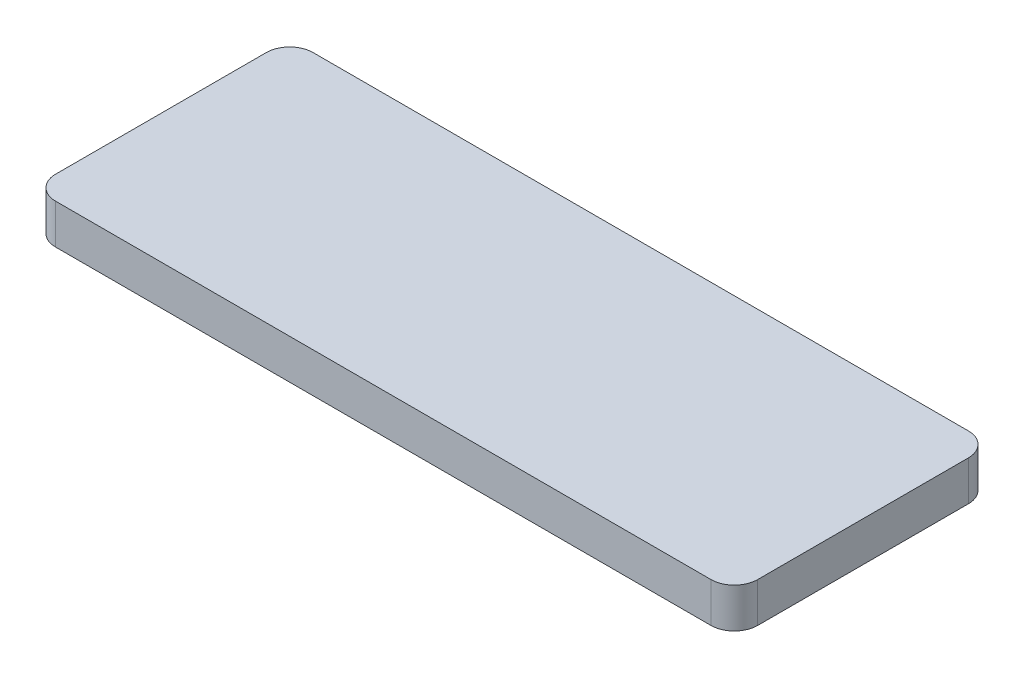
ISO-10303-21;
HEADER;
FILE_DESCRIPTION(('STEP AP214'),'2;1');
FILE_NAME('part.step','',(''),(''),'','','');
FILE_SCHEMA(('AUTOMOTIVE_DESIGN { 1 0 10303 214 1 1 1 1 }'));
ENDSEC;
DATA;
#1=APPLICATION_CONTEXT('core data for automotive mechanical design processes');
#2=APPLICATION_PROTOCOL_DEFINITION('international standard','automotive_design',2000,#1);
#3=PRODUCT_CONTEXT('',#1,'mechanical');
#4=PRODUCT('Part','Part','',(#3));
#5=PRODUCT_RELATED_PRODUCT_CATEGORY('part','',(#4));
#6=PRODUCT_DEFINITION_FORMATION('','',#4);
#7=PRODUCT_DEFINITION_CONTEXT('part definition',#1,'design');
#8=PRODUCT_DEFINITION('design','',#6,#7);
#9=PRODUCT_DEFINITION_SHAPE('','',#8);
#10=(LENGTH_UNIT() NAMED_UNIT(*) SI_UNIT(.MILLI.,.METRE.));
#11=(NAMED_UNIT(*) PLANE_ANGLE_UNIT() SI_UNIT($,.RADIAN.));
#12=(NAMED_UNIT(*) SI_UNIT($,.STERADIAN.) SOLID_ANGLE_UNIT());
#13=UNCERTAINTY_MEASURE_WITH_UNIT(LENGTH_MEASURE(1.E-05),#10,'distance_accuracy_value','');
#14=(GEOMETRIC_REPRESENTATION_CONTEXT(3) GLOBAL_UNCERTAINTY_ASSIGNED_CONTEXT((#13)) GLOBAL_UNIT_ASSIGNED_CONTEXT((#10,
#11,#12)) REPRESENTATION_CONTEXT('',''));
#15=CARTESIAN_POINT('',(0.,0.,0.));
#16=DIRECTION('',(0.,0.,1.));
#17=DIRECTION('',(1.,0.,0.));
#18=AXIS2_PLACEMENT_3D('',#15,#16,#17);
#19=CARTESIAN_POINT('',(-70.,8.5,22.5));
#20=DIRECTION('',(0.,-1.,0.));
#21=DIRECTION('',(0.,0.,-1.));
#22=AXIS2_PLACEMENT_3D('',#19,#20,#21);
#23=CYLINDRICAL_SURFACE('',#22,5.);
#24=CARTESIAN_POINT('',(-70.,0.,22.5));
#25=DIRECTION('',(0.,1.,0.));
#26=DIRECTION('',(0.,0.,-1.));
#27=AXIS2_PLACEMENT_3D('',#24,#25,#26);
#28=CIRCLE('',#27,5.);
#29=CARTESIAN_POINT('',(-75.,0.,22.5));
#30=VERTEX_POINT('',#29);
#31=CARTESIAN_POINT('',(-70.,0.,27.5));
#32=VERTEX_POINT('',#31);
#33=EDGE_CURVE('E129',#30,#32,#28,.T.);
#34=ORIENTED_EDGE('',*,*,#33,.T.);
#35=DIRECTION('',(0.,-1.,0.));
#36=VECTOR('',#35,1.);
#37=CARTESIAN_POINT('',(-70.,8.5,27.5));
#38=LINE('',#37,#36);
#39=CARTESIAN_POINT('',(-70.,8.5,27.5));
#40=VERTEX_POINT('',#39);
#41=EDGE_CURVE('E11',#40,#32,#38,.T.);
#42=ORIENTED_EDGE('',*,*,#41,.F.);
#43=CARTESIAN_POINT('',(-70.,8.5,22.5));
#44=DIRECTION('',(0.,1.,0.));
#45=DIRECTION('',(0.,0.,-1.));
#46=AXIS2_PLACEMENT_3D('',#43,#44,#45);
#47=CIRCLE('',#46,5.);
#48=CARTESIAN_POINT('',(-75.,8.5,22.5));
#49=VERTEX_POINT('',#48);
#50=EDGE_CURVE('E143',#49,#40,#47,.T.);
#51=ORIENTED_EDGE('',*,*,#50,.F.);
#52=DIRECTION('',(0.,-1.,0.));
#53=VECTOR('',#52,1.);
#54=CARTESIAN_POINT('',(-75.,8.5,22.5));
#55=LINE('',#54,#53);
#56=EDGE_CURVE('E125',#49,#30,#55,.T.);
#57=ORIENTED_EDGE('',*,*,#56,.T.);
#58=EDGE_LOOP('',(#34,#42,#51,#57));
#59=FACE_BOUND('',#58,.T.);
#60=ADVANCED_FACE('F33',(#59),#23,.T.);
#61=CARTESIAN_POINT('',(-70.,8.5,27.5));
#62=DIRECTION('',(0.,0.,-1.));
#63=DIRECTION('',(-1.,0.,0.));
#64=AXIS2_PLACEMENT_3D('',#61,#62,#63);
#65=PLANE('',#64);
#66=DIRECTION('',(1.,0.,0.));
#67=VECTOR('',#66,1.);
#68=CARTESIAN_POINT('',(-70.,0.,27.5));
#69=LINE('',#68,#67);
#70=CARTESIAN_POINT('',(70.,0.,27.5));
#71=VERTEX_POINT('',#70);
#72=EDGE_CURVE('E132',#32,#71,#69,.T.);
#73=ORIENTED_EDGE('',*,*,#72,.T.);
#74=DIRECTION('',(0.,-1.,0.));
#75=VECTOR('',#74,1.);
#76=CARTESIAN_POINT('',(70.,8.5,27.5));
#77=LINE('',#76,#75);
#78=CARTESIAN_POINT('',(70.,8.5,27.5));
#79=VERTEX_POINT('',#78);
#80=EDGE_CURVE('E41',#79,#71,#77,.T.);
#81=ORIENTED_EDGE('',*,*,#80,.F.);
#82=DIRECTION('',(1.,0.,0.));
#83=VECTOR('',#82,1.);
#84=CARTESIAN_POINT('',(-70.,8.5,27.5));
#85=LINE('',#84,#83);
#86=EDGE_CURVE('E92',#40,#79,#85,.T.);
#87=ORIENTED_EDGE('',*,*,#86,.F.);
#88=ORIENTED_EDGE('',*,*,#41,.T.);
#89=EDGE_LOOP('',(#73,#81,#87,#88));
#90=FACE_BOUND('',#89,.T.);
#91=ADVANCED_FACE('F178',(#90),#65,.F.);
#92=CARTESIAN_POINT('',(70.,8.5,22.5));
#93=DIRECTION('',(0.,-1.,0.));
#94=DIRECTION('',(0.,0.,-1.));
#95=AXIS2_PLACEMENT_3D('',#92,#93,#94);
#96=CYLINDRICAL_SURFACE('',#95,5.);
#97=CARTESIAN_POINT('',(70.,0.,22.5));
#98=DIRECTION('',(0.,1.,0.));
#99=DIRECTION('',(0.,0.,1.));
#100=AXIS2_PLACEMENT_3D('',#97,#98,#99);
#101=CIRCLE('',#100,5.);
#102=CARTESIAN_POINT('',(75.,0.,22.5));
#103=VERTEX_POINT('',#102);
#104=EDGE_CURVE('E134',#71,#103,#101,.T.);
#105=ORIENTED_EDGE('',*,*,#104,.T.);
#106=DIRECTION('',(0.,-1.,0.));
#107=VECTOR('',#106,1.);
#108=CARTESIAN_POINT('',(75.,8.5,22.5));
#109=LINE('',#108,#107);
#110=CARTESIAN_POINT('',(75.,8.5,22.5));
#111=VERTEX_POINT('',#110);
#112=EDGE_CURVE('E150',#111,#103,#109,.T.);
#113=ORIENTED_EDGE('',*,*,#112,.F.);
#114=CARTESIAN_POINT('',(70.,8.5,22.5));
#115=DIRECTION('',(0.,1.,0.));
#116=DIRECTION('',(0.,0.,1.));
#117=AXIS2_PLACEMENT_3D('',#114,#115,#116);
#118=CIRCLE('',#117,5.);
#119=EDGE_CURVE('E158',#79,#111,#118,.T.);
#120=ORIENTED_EDGE('',*,*,#119,.F.);
#121=ORIENTED_EDGE('',*,*,#80,.T.);
#122=EDGE_LOOP('',(#105,#113,#120,#121));
#123=FACE_BOUND('',#122,.T.);
#124=ADVANCED_FACE('F156',(#123),#96,.T.);
#125=CARTESIAN_POINT('',(75.,8.5,22.5));
#126=DIRECTION('',(-1.,0.,0.));
#127=DIRECTION('',(0.,0.,1.));
#128=AXIS2_PLACEMENT_3D('',#125,#126,#127);
#129=PLANE('',#128);
#130=DIRECTION('',(0.,0.,-1.));
#131=VECTOR('',#130,1.);
#132=CARTESIAN_POINT('',(75.,0.,22.5));
#133=LINE('',#132,#131);
#134=CARTESIAN_POINT('',(75.,0.,-22.5));
#135=VERTEX_POINT('',#134);
#136=EDGE_CURVE('E136',#103,#135,#133,.T.);
#137=ORIENTED_EDGE('',*,*,#136,.T.);
#138=DIRECTION('',(0.,-1.,0.));
#139=VECTOR('',#138,1.);
#140=CARTESIAN_POINT('',(75.,8.5,-22.5));
#141=LINE('',#140,#139);
#142=CARTESIAN_POINT('',(75.,8.5,-22.5));
#143=VERTEX_POINT('',#142);
#144=EDGE_CURVE('E147',#143,#135,#141,.T.);
#145=ORIENTED_EDGE('',*,*,#144,.F.);
#146=DIRECTION('',(0.,0.,-1.));
#147=VECTOR('',#146,1.);
#148=CARTESIAN_POINT('',(75.,8.5,22.5));
#149=LINE('',#148,#147);
#150=EDGE_CURVE('E170',#111,#143,#149,.T.);
#151=ORIENTED_EDGE('',*,*,#150,.F.);
#152=ORIENTED_EDGE('',*,*,#112,.T.);
#153=EDGE_LOOP('',(#137,#145,#151,#152));
#154=FACE_BOUND('',#153,.T.);
#155=ADVANCED_FACE('F166',(#154),#129,.F.);
#156=CARTESIAN_POINT('',(70.,8.5,-22.5));
#157=DIRECTION('',(0.,-1.,0.));
#158=DIRECTION('',(0.,0.,-1.));
#159=AXIS2_PLACEMENT_3D('',#156,#157,#158);
#160=CYLINDRICAL_SURFACE('',#159,5.);
#161=CARTESIAN_POINT('',(70.,0.,-22.5));
#162=DIRECTION('',(0.,1.,0.));
#163=DIRECTION('',(0.,0.,-1.));
#164=AXIS2_PLACEMENT_3D('',#161,#162,#163);
#165=CIRCLE('',#164,5.);
#166=CARTESIAN_POINT('',(70.,0.,-27.5));
#167=VERTEX_POINT('',#166);
#168=EDGE_CURVE('E138',#135,#167,#165,.T.);
#169=ORIENTED_EDGE('',*,*,#168,.T.);
#170=DIRECTION('',(0.,-1.,0.));
#171=VECTOR('',#170,1.);
#172=CARTESIAN_POINT('',(70.,8.5,-27.5));
#173=LINE('',#172,#171);
#174=CARTESIAN_POINT('',(70.,8.5,-27.5));
#175=VERTEX_POINT('',#174);
#176=EDGE_CURVE('E120',#175,#167,#173,.T.);
#177=ORIENTED_EDGE('',*,*,#176,.F.);
#178=CARTESIAN_POINT('',(70.,8.5,-22.5));
#179=DIRECTION('',(0.,1.,0.));
#180=DIRECTION('',(0.,0.,-1.));
#181=AXIS2_PLACEMENT_3D('',#178,#179,#180);
#182=CIRCLE('',#181,5.);
#183=EDGE_CURVE('E111',#143,#175,#182,.T.);
#184=ORIENTED_EDGE('',*,*,#183,.F.);
#185=ORIENTED_EDGE('',*,*,#144,.T.);
#186=EDGE_LOOP('',(#169,#177,#184,#185));
#187=FACE_BOUND('',#186,.T.);
#188=ADVANCED_FACE('F169',(#187),#160,.T.);
#189=CARTESIAN_POINT('',(-70.,8.5,-27.5));
#190=DIRECTION('',(0.,0.,1.));
#191=DIRECTION('',(1.,0.,0.));
#192=AXIS2_PLACEMENT_3D('',#189,#190,#191);
#193=PLANE('',#192);
#194=DIRECTION('',(-1.,0.,0.));
#195=VECTOR('',#194,1.);
#196=CARTESIAN_POINT('',(-70.,0.,-27.5));
#197=LINE('',#196,#195);
#198=CARTESIAN_POINT('',(-70.,0.,-27.5));
#199=VERTEX_POINT('',#198);
#200=EDGE_CURVE('E119',#167,#199,#197,.T.);
#201=ORIENTED_EDGE('',*,*,#200,.T.);
#202=DIRECTION('',(0.,-1.,0.));
#203=VECTOR('',#202,1.);
#204=CARTESIAN_POINT('',(-70.,8.5,-27.5));
#205=LINE('',#204,#203);
#206=CARTESIAN_POINT('',(-70.,8.5,-27.5));
#207=VERTEX_POINT('',#206);
#208=EDGE_CURVE('E116',#207,#199,#205,.T.);
#209=ORIENTED_EDGE('',*,*,#208,.F.);
#210=DIRECTION('',(-1.,0.,0.));
#211=VECTOR('',#210,1.);
#212=CARTESIAN_POINT('',(-70.,8.5,-27.5));
#213=LINE('',#212,#211);
#214=EDGE_CURVE('E105',#175,#207,#213,.T.);
#215=ORIENTED_EDGE('',*,*,#214,.F.);
#216=ORIENTED_EDGE('',*,*,#176,.T.);
#217=EDGE_LOOP('',(#201,#209,#215,#216));
#218=FACE_BOUND('',#217,.T.);
#219=ADVANCED_FACE('F117',(#218),#193,.F.);
#220=CARTESIAN_POINT('',(-70.,8.5,-22.5));
#221=DIRECTION('',(0.,-1.,0.));
#222=DIRECTION('',(0.,0.,-1.));
#223=AXIS2_PLACEMENT_3D('',#220,#221,#222);
#224=CYLINDRICAL_SURFACE('',#223,5.);
#225=CARTESIAN_POINT('',(-70.,0.,-22.5));
#226=DIRECTION('',(0.,1.,0.));
#227=DIRECTION('',(0.,0.,-1.));
#228=AXIS2_PLACEMENT_3D('',#225,#226,#227);
#229=CIRCLE('',#228,5.);
#230=CARTESIAN_POINT('',(-75.,0.,-22.5));
#231=VERTEX_POINT('',#230);
#232=EDGE_CURVE('E78',#199,#231,#229,.T.);
#233=ORIENTED_EDGE('',*,*,#232,.T.);
#234=DIRECTION('',(0.,-1.,0.));
#235=VECTOR('',#234,1.);
#236=CARTESIAN_POINT('',(-75.,8.5,-22.5));
#237=LINE('',#236,#235);
#238=CARTESIAN_POINT('',(-75.,8.5,-22.5));
#239=VERTEX_POINT('',#238);
#240=EDGE_CURVE('E121',#239,#231,#237,.T.);
#241=ORIENTED_EDGE('',*,*,#240,.F.);
#242=CARTESIAN_POINT('',(-70.,8.5,-22.5));
#243=DIRECTION('',(0.,1.,0.));
#244=DIRECTION('',(0.,0.,-1.));
#245=AXIS2_PLACEMENT_3D('',#242,#243,#244);
#246=CIRCLE('',#245,5.);
#247=EDGE_CURVE('E109',#207,#239,#246,.T.);
#248=ORIENTED_EDGE('',*,*,#247,.F.);
#249=ORIENTED_EDGE('',*,*,#208,.T.);
#250=EDGE_LOOP('',(#233,#241,#248,#249));
#251=FACE_BOUND('',#250,.T.);
#252=ADVANCED_FACE('F123',(#251),#224,.T.);
#253=CARTESIAN_POINT('',(-75.,8.5,22.5));
#254=DIRECTION('',(1.,0.,0.));
#255=DIRECTION('',(0.,0.,-1.));
#256=AXIS2_PLACEMENT_3D('',#253,#254,#255);
#257=PLANE('',#256);
#258=DIRECTION('',(0.,0.,1.));
#259=VECTOR('',#258,1.);
#260=CARTESIAN_POINT('',(-75.,0.,22.5));
#261=LINE('',#260,#259);
#262=EDGE_CURVE('E84',#231,#30,#261,.T.);
#263=ORIENTED_EDGE('',*,*,#262,.T.);
#264=ORIENTED_EDGE('',*,*,#56,.F.);
#265=DIRECTION('',(0.,0.,1.));
#266=VECTOR('',#265,1.);
#267=CARTESIAN_POINT('',(-75.,8.5,22.5));
#268=LINE('',#267,#266);
#269=EDGE_CURVE('E49',#239,#49,#268,.T.);
#270=ORIENTED_EDGE('',*,*,#269,.F.);
#271=ORIENTED_EDGE('',*,*,#240,.T.);
#272=EDGE_LOOP('',(#263,#264,#270,#271));
#273=FACE_BOUND('',#272,.T.);
#274=ADVANCED_FACE('F194',(#273),#257,.F.);
#275=CARTESIAN_POINT('',(-70.,8.5,22.5));
#276=DIRECTION('',(0.,-1.,0.));
#277=DIRECTION('',(0.,0.,-1.));
#278=AXIS2_PLACEMENT_3D('',#275,#276,#277);
#279=PLANE('',#278);
#280=ORIENTED_EDGE('',*,*,#50,.T.);
#281=ORIENTED_EDGE('',*,*,#86,.T.);
#282=ORIENTED_EDGE('',*,*,#119,.T.);
#283=ORIENTED_EDGE('',*,*,#150,.T.);
#284=ORIENTED_EDGE('',*,*,#183,.T.);
#285=ORIENTED_EDGE('',*,*,#214,.T.);
#286=ORIENTED_EDGE('',*,*,#247,.T.);
#287=ORIENTED_EDGE('',*,*,#269,.T.);
#288=EDGE_LOOP('',(#280,#281,#282,#283,#284,#285,#286,#287));
#289=FACE_BOUND('',#288,.T.);
#290=ADVANCED_FACE('F107',(#289),#279,.F.);
#291=CARTESIAN_POINT('',(-70.,0.,22.5));
#292=DIRECTION('',(0.,-1.,0.));
#293=DIRECTION('',(0.,0.,-1.));
#294=AXIS2_PLACEMENT_3D('',#291,#292,#293);
#295=PLANE('',#294);
#296=ORIENTED_EDGE('',*,*,#33,.F.);
#297=ORIENTED_EDGE('',*,*,#262,.F.);
#298=ORIENTED_EDGE('',*,*,#232,.F.);
#299=ORIENTED_EDGE('',*,*,#200,.F.);
#300=ORIENTED_EDGE('',*,*,#168,.F.);
#301=ORIENTED_EDGE('',*,*,#136,.F.);
#302=ORIENTED_EDGE('',*,*,#104,.F.);
#303=ORIENTED_EDGE('',*,*,#72,.F.);
#304=EDGE_LOOP('',(#296,#297,#298,#299,#300,#301,#302,#303));
#305=FACE_BOUND('',#304,.T.);
#306=ADVANCED_FACE('F162',(#305),#295,.T.);
#307=CLOSED_SHELL('',(#60,#91,#124,#155,#188,#219,#252,#274,#290,#306));
#308=MANIFOLD_SOLID_BREP('B2',#307);
#309=ADVANCED_BREP_SHAPE_REPRESENTATION('',(#18,#308),#14);
#310=SHAPE_DEFINITION_REPRESENTATION(#9,#309);
ENDSEC;
END-ISO-10303-21;
